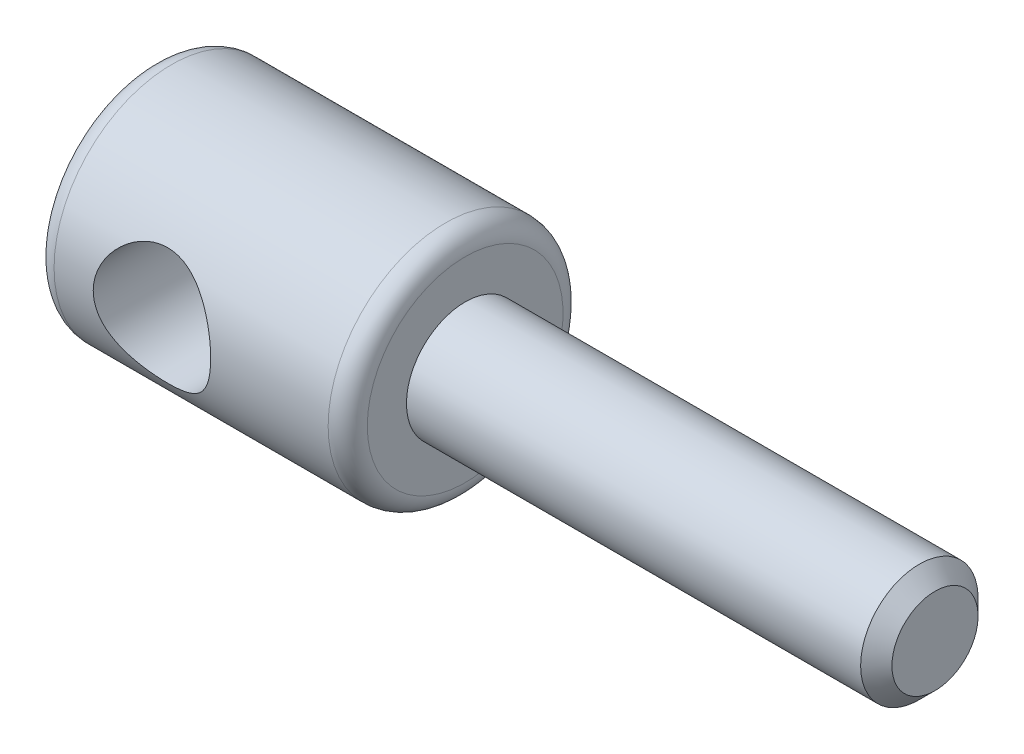
ISO-10303-21;
HEADER;
FILE_DESCRIPTION(('STEP AP214'),'2;1');
FILE_NAME('part.step','',(''),(''),'','','');
FILE_SCHEMA(('AUTOMOTIVE_DESIGN { 1 0 10303 214 1 1 1 1 }'));
ENDSEC;
DATA;
#1=APPLICATION_CONTEXT('core data for automotive mechanical design processes');
#2=APPLICATION_PROTOCOL_DEFINITION('international standard','automotive_design',2000,#1);
#3=PRODUCT_CONTEXT('',#1,'mechanical');
#4=PRODUCT('Part','Part','',(#3));
#5=PRODUCT_RELATED_PRODUCT_CATEGORY('part','',(#4));
#6=PRODUCT_DEFINITION_FORMATION('','',#4);
#7=PRODUCT_DEFINITION_CONTEXT('part definition',#1,'design');
#8=PRODUCT_DEFINITION('design','',#6,#7);
#9=PRODUCT_DEFINITION_SHAPE('','',#8);
#10=(LENGTH_UNIT() NAMED_UNIT(*) SI_UNIT(.MILLI.,.METRE.));
#11=(NAMED_UNIT(*) PLANE_ANGLE_UNIT() SI_UNIT($,.RADIAN.));
#12=(NAMED_UNIT(*) SI_UNIT($,.STERADIAN.) SOLID_ANGLE_UNIT());
#13=UNCERTAINTY_MEASURE_WITH_UNIT(LENGTH_MEASURE(1.E-05),#10,'distance_accuracy_value','');
#14=(GEOMETRIC_REPRESENTATION_CONTEXT(3) GLOBAL_UNCERTAINTY_ASSIGNED_CONTEXT((#13)) GLOBAL_UNIT_ASSIGNED_CONTEXT((#10,
#11,#12)) REPRESENTATION_CONTEXT('',''));
#15=CARTESIAN_POINT('',(0.,0.,0.));
#16=DIRECTION('',(0.,0.,1.));
#17=DIRECTION('',(1.,0.,0.));
#18=AXIS2_PLACEMENT_3D('',#15,#16,#17);
#19=CARTESIAN_POINT('',(0.,0.,0.));
#20=DIRECTION('',(1.,0.,0.));
#21=DIRECTION('',(0.,0.,-1.));
#22=AXIS2_PLACEMENT_3D('',#19,#20,#21);
#23=PLANE('',#22);
#24=CARTESIAN_POINT('',(0.,0.,0.));
#25=DIRECTION('',(1.,0.,0.));
#26=DIRECTION('',(0.,0.,-1.));
#27=AXIS2_PLACEMENT_3D('',#24,#25,#26);
#28=CIRCLE('',#27,7.9375);
#29=CARTESIAN_POINT('',(0.,0.,-7.9375));
#30=VERTEX_POINT('',#29);
#31=EDGE_CURVE('E51',#30,#30,#28,.F.);
#32=ORIENTED_EDGE('',*,*,#31,.T.);
#33=EDGE_LOOP('',(#32));
#34=FACE_BOUND('',#33,.T.);
#35=ADVANCED_FACE('F36',(#34),#23,.F.);
#36=CARTESIAN_POINT('',(-10.4442661148603,0.,0.));
#37=DIRECTION('',(-1.,0.,0.));
#38=DIRECTION('',(0.,0.,1.));
#39=AXIS2_PLACEMENT_3D('',#36,#37,#38);
#40=CYLINDRICAL_SURFACE('',#39,9.525);
#41=CARTESIAN_POINT('',(14.2875,0.,9.525));
#42=CARTESIAN_POINT('',(14.2874995883142,-0.125243167799989,9.5249996206372));
#43=CARTESIAN_POINT('',(14.2825538815409,-0.250495089131835,9.52252400598023));
#44=CARTESIAN_POINT('',(14.2628274933583,-0.500076393496526,9.51268396387997));
#45=CARTESIAN_POINT('',(14.2480425334198,-0.624405351393145,9.50531740964971));
#46=CARTESIAN_POINT('',(14.2087846575478,-0.871331001268147,9.48587193787975));
#47=CARTESIAN_POINT('',(14.184297925728,-0.993924963523297,9.47378630044847));
#48=CARTESIAN_POINT('',(14.1259077343834,-1.23637011508467,9.44520637539277));
#49=CARTESIAN_POINT('',(14.0920004252214,-1.35622016139572,9.42871028557932));
#50=CARTESIAN_POINT('',(14.0152959954649,-1.59183120722171,9.39179697222459));
#51=CARTESIAN_POINT('',(13.9725381122571,-1.70760770137533,9.37139708461428));
#52=CARTESIAN_POINT('',(13.8784500200897,-1.93495086483045,9.3271126718355));
#53=CARTESIAN_POINT('',(13.8271165847989,-2.04651593025,9.30322683559748));
#54=CARTESIAN_POINT('',(13.6609458534294,-2.37384489745524,9.22716144615755));
#55=CARTESIAN_POINT('',(13.5338526884547,-2.58250225923313,9.17053150857179));
#56=CARTESIAN_POINT('',(13.2420309696508,-2.9885453858336,9.04666081910159));
#57=CARTESIAN_POINT('',(13.0754907176509,-3.18448556312959,8.97898540114139));
#58=CARTESIAN_POINT('',(12.7134088932679,-3.5469969745544,8.84205954293001));
#59=CARTESIAN_POINT('',(12.5178454279268,-3.71354582861884,8.77280794740667));
#60=CARTESIAN_POINT('',(12.0848674226152,-4.02553537328567,8.63435408613187));
#61=CARTESIAN_POINT('',(11.8453834507436,-4.16833749963762,8.56557212539103));
#62=CARTESIAN_POINT('',(11.4681780616274,-4.35029005345508,8.47379640254792));
#63=CARTESIAN_POINT('',(11.339399825047,-4.40557901885787,8.44509626519091));
#64=CARTESIAN_POINT('',(11.0766213108777,-4.50483773649694,8.39256904955604));
#65=CARTESIAN_POINT('',(10.9426241795386,-4.54881419057647,8.36873908777994));
#66=CARTESIAN_POINT('',(10.6784843907029,-4.62261399582858,8.32818911059645));
#67=CARTESIAN_POINT('',(10.5485845780924,-4.65312214328153,8.31113119648639));
#68=CARTESIAN_POINT('',(10.2861183128582,-4.70318378391281,8.28290506375683));
#69=CARTESIAN_POINT('',(10.1535533138226,-4.72274308921002,8.27173372047612));
#70=CARTESIAN_POINT('',(9.88694274554475,-4.75061653464239,8.25575723957705));
#71=CARTESIAN_POINT('',(9.75289811708642,-4.75893744712047,8.25094826797976));
#72=CARTESIAN_POINT('',(9.48451818068096,-4.76421854927812,8.24790017307781));
#73=CARTESIAN_POINT('',(9.35018290168949,-4.76117982286954,8.24966042295241));
#74=CARTESIAN_POINT('',(9.0985605369466,-4.74483797280581,8.25906842780931));
#75=CARTESIAN_POINT('',(8.98116126726877,-4.73280973448218,8.2659846789569));
#76=CARTESIAN_POINT('',(8.74793667425509,-4.7001560114978,8.28459407928506));
#77=CARTESIAN_POINT('',(8.63211185707073,-4.67952782662532,8.29628872876442));
#78=CARTESIAN_POINT('',(8.28820359489727,-4.60506661909892,8.33800444414718));
#79=CARTESIAN_POINT('',(8.06351322141475,-4.53864529577751,8.37466460391199));
#80=CARTESIAN_POINT('',(7.62363577254265,-4.37297035741612,8.46236620531704));
#81=CARTESIAN_POINT('',(7.40879196497443,-4.27298801966147,8.51372273880604));
#82=CARTESIAN_POINT('',(6.99786249608706,-4.04355977442936,8.62505005190895));
#83=CARTESIAN_POINT('',(6.80178531682722,-3.91410063264099,8.68502469635285));
#84=CARTESIAN_POINT('',(6.40784506896536,-3.61029947812719,8.8160120789406));
#85=CARTESIAN_POINT('',(6.21290797985575,-3.43234782914613,8.88746017331488));
#86=CARTESIAN_POINT('',(5.85435121852992,-3.04584295330871,9.02721381532401));
#87=CARTESIAN_POINT('',(5.69074651343943,-2.83727518509305,9.0955178493011));
#88=CARTESIAN_POINT('',(5.46883467336283,-2.49965137796344,9.19195370403877));
#89=CARTESIAN_POINT('',(5.39748202968255,-2.38002127368373,9.22372787983903));
#90=CARTESIAN_POINT('',(5.26522178631796,-2.13427687141612,9.28366556941997));
#91=CARTESIAN_POINT('',(5.20430978353973,-2.00816533613018,9.31183060399966));
#92=CARTESIAN_POINT('',(5.09359004451779,-1.75034069526616,9.36371844925579));
#93=CARTESIAN_POINT('',(5.04377783818484,-1.61862987016266,9.38744304755806));
#94=CARTESIAN_POINT('',(4.95583376217831,-1.3505610663951,9.42974072645533));
#95=CARTESIAN_POINT('',(4.91770054882684,-1.21420362433566,9.4483143996453));
#96=CARTESIAN_POINT('',(4.85628927908232,-0.949450109300049,9.47841891468132));
#97=CARTESIAN_POINT('',(4.83204248612877,-0.821329961906903,9.49040564136936));
#98=CARTESIAN_POINT('',(4.79411534118488,-0.563164063018348,9.50921741531494));
#99=CARTESIAN_POINT('',(4.78043405513057,-0.433118482780759,9.51604291885924));
#100=CARTESIAN_POINT('',(4.76382096304197,-0.172222200636558,9.52433687415141));
#101=CARTESIAN_POINT('',(4.76088504167853,-0.0413718261918282,9.52580737679104));
#102=CARTESIAN_POINT('',(4.76579143418983,0.220072847166308,9.52335444060485));
#103=CARTESIAN_POINT('',(4.77363327106403,0.350667157156418,9.51943124049279));
#104=CARTESIAN_POINT('',(4.79896043682593,0.600383632816323,9.50681651861088));
#105=CARTESIAN_POINT('',(4.81564795465564,0.71960779805965,9.49851975936574));
#106=CARTESIAN_POINT('',(4.85791618607806,0.956123558476324,9.47763434053446));
#107=CARTESIAN_POINT('',(4.88349971649687,1.07341452918894,9.46504432155854));
#108=CARTESIAN_POINT('',(4.94328705590224,1.30523272581463,9.43586934009923));
#109=CARTESIAN_POINT('',(4.97748822700577,1.41976078572846,9.41928560017321));
#110=CARTESIAN_POINT('',(5.05418232366048,1.64542419391326,9.382499981618));
#111=CARTESIAN_POINT('',(5.09667842551346,1.75655822362735,9.36229671724176));
#112=CARTESIAN_POINT('',(5.2387002860248,2.09007412634845,9.29566539786795));
#113=CARTESIAN_POINT('',(5.35108855655025,2.3061103310862,9.24405921515466));
#114=CARTESIAN_POINT('',(5.60598846404179,2.71685918550571,9.13180205397676));
#115=CARTESIAN_POINT('',(5.74851293334768,2.91156269769227,9.07114722574502));
#116=CARTESIAN_POINT('',(6.07579489471238,3.29452731372962,8.93960783885979));
#117=CARTESIAN_POINT('',(6.26332528614419,3.48027815582499,8.868303631423));
#118=CARTESIAN_POINT('',(6.66718618662009,3.81886460963264,8.72786114875584));
#119=CARTESIAN_POINT('',(6.88353645260841,3.97167745144758,8.65872439991558));
#120=CARTESIAN_POINT('',(7.23184726433336,4.17638881115549,8.56092960704944));
#121=CARTESIAN_POINT('',(7.35506295800265,4.24173741059432,8.52864647367417));
#122=CARTESIAN_POINT('',(7.60751663099196,4.36167001930206,8.46793790675362));
#123=CARTESIAN_POINT('',(7.73675184965806,4.41625890421415,8.43951072775552));
#124=CARTESIAN_POINT('',(8.00031137614728,4.51403084118841,8.3876228681576));
#125=CARTESIAN_POINT('',(8.13463142160191,4.55722321448887,8.36415813189979));
#126=CARTESIAN_POINT('',(8.40742321829063,4.63167416627274,8.32316235190995));
#127=CARTESIAN_POINT('',(8.54589432311323,4.66293459251874,8.30563038948562));
#128=CARTESIAN_POINT('',(8.81230614491235,4.71062527640278,8.27866590076996));
#129=CARTESIAN_POINT('',(8.93998200867175,4.72819092555356,8.26861751501085));
#130=CARTESIAN_POINT('',(9.19665919652675,4.75291664228842,8.25443000373948));
#131=CARTESIAN_POINT('',(9.32566038032394,4.76007780009145,8.25029025909993));
#132=CARTESIAN_POINT('',(9.5838234710669,4.76388567177541,8.24809207938036));
#133=CARTESIAN_POINT('',(9.71298530555926,4.76053608147038,8.25003150672727));
#134=CARTESIAN_POINT('',(9.97037524394535,4.74338307929259,8.2599055190099));
#135=CARTESIAN_POINT('',(10.0986033858471,4.72958009537706,8.26783985851659));
#136=CARTESIAN_POINT('',(10.3408735925565,4.69353669139923,8.28834856879423));
#137=CARTESIAN_POINT('',(10.4550996380418,4.67222934629288,8.30040666790683));
#138=CARTESIAN_POINT('',(10.6812027840155,4.62147643847892,8.32877048505192));
#139=CARTESIAN_POINT('',(10.7930791465907,4.59202835912458,8.34507751652014));
#140=CARTESIAN_POINT('',(11.124168552145,4.49189766535446,8.3996615585496));
#141=CARTESIAN_POINT('',(11.3389944304742,4.40940547807409,8.44361545117001));
#142=CARTESIAN_POINT('',(11.7663852260527,4.20916574352957,8.54528603634261));
#143=CARTESIAN_POINT('',(11.9778285423799,4.08942191082135,8.60372898549137));
#144=CARTESIAN_POINT('',(12.3790368143899,3.82024338512735,8.72658246261696));
#145=CARTESIAN_POINT('',(12.5687904104806,3.67079324521365,8.79099608593484));
#146=CARTESIAN_POINT('',(12.9451492351934,3.32520368388597,8.92789150982252));
#147=CARTESIAN_POINT('',(13.1285704078762,3.12559766366325,9.00040265167881));
#148=CARTESIAN_POINT('',(13.4600960361771,2.69626914168463,9.13818513010387));
#149=CARTESIAN_POINT('',(13.6081814555508,2.4665305095516,9.20345255422175));
#150=CARTESIAN_POINT('',(13.8004204698368,2.10268072495819,9.29086610240478));
#151=CARTESIAN_POINT('',(13.8597008931346,1.97763300723183,9.31834760006229));
#152=CARTESIAN_POINT('',(13.9673991887047,1.72211552262134,9.36893044835914));
#153=CARTESIAN_POINT('',(14.0158223974304,1.59164845695407,9.39203394996841));
#154=CARTESIAN_POINT('',(14.1011390300447,1.32654199767926,9.43312646132604));
#155=CARTESIAN_POINT('',(14.1380576010708,1.19191242135595,9.45112661821364));
#156=CARTESIAN_POINT('',(14.2000010604458,0.919388438520272,9.48151473751691));
#157=CARTESIAN_POINT('',(14.225033214082,0.781496080561078,9.49390612793916));
#158=CARTESIAN_POINT('',(14.2584244917289,0.536297175823774,9.51048759454479));
#159=CARTESIAN_POINT('',(14.2693184453916,0.42941158376785,9.51592021375587));
#160=CARTESIAN_POINT('',(14.2838564762833,0.215019489362878,9.52317662911679));
#161=CARTESIAN_POINT('',(14.287500353405,0.107512969957934,9.52500032565785));
#162=CARTESIAN_POINT('',(14.2875,0.,9.525));
#163=B_SPLINE_CURVE_WITH_KNOTS('',3,(#41,#42,#43,#44,#45,#46,#47,#48,#49,#50,#51,#52,#53,#54,
#55,#56,#57,#58,#59,#60,#61,#62,#63,#64,#65,#66,#67,#68,#69,#70,#71,#72,#73,#74,#75,#76,#77,#78,
#79,#80,#81,#82,#83,#84,#85,#86,#87,#88,#89,#90,#91,#92,#93,#94,#95,#96,#97,#98,#99,#100,#101,
#102,#103,#104,#105,#106,#107,#108,#109,#110,#111,#112,#113,#114,#115,#116,#117,#118,#119,#120,
#121,#122,#123,#124,#125,#126,#127,#128,#129,#130,#131,#132,#133,#134,#135,#136,#137,#138,#139,
#140,#141,#142,#143,#144,#145,#146,#147,#148,#149,#150,#151,#152,#153,#154,#155,#156,#157,#158,
#159,#160,#161,#162),.UNSPECIFIED.,.T.,.F.,(4,2,2,2,2,2,2,2,2,2,2,2,2,2,2,2,2,2,2,2,2,2,2,2,2,2,
2,2,2,2,2,2,2,2,2,2,2,2,2,2,2,2,2,2,2,2,2,2,2,2,2,2,2,2,2,2,2,2,2,2,4),(0.,0.37562341815402,
0.751410280296021,1.12773421934005,1.50421216665562,1.87905550525341,2.25404018794787,
3.00318908218551,3.79765979831069,4.59273287924314,5.44946389368039,5.8781190538996,
6.30651967909289,6.70950847539315,7.11228314445237,7.51481498990845,7.91730842763879,
8.27152461989833,8.62585211283934,9.33399259637595,10.0586277474397,10.7835888844336,
11.6004728904415,12.4177461446779,12.8458801890468,13.2738332313566,13.701613616489,
14.1293447666274,14.521651524315,14.913923595397,15.3060454158579,15.698149882404,
16.0597456619957,16.4214560413944,16.7830558344937,17.144794364286,17.8882174899416,
18.6319578135026,19.4487341785404,20.2660733794108,20.6950689367829,21.1238696504806,
21.5523185520335,21.9807010777177,22.3679690015927,22.7551963432537,23.1422875423821,
23.5293628950278,23.8794231642634,24.2295917732494,24.9294696536929,25.6763690993088,
26.4236579446131,27.2617475314397,28.1002876036314,28.5230685284024,28.9456411934233,
29.3672836019069,29.7886679587935,30.1111069020891,30.4335547448008),.UNSPECIFIED.);
#164=CARTESIAN_POINT('',(14.2875,0.,9.525));
#165=VERTEX_POINT('',#164);
#166=EDGE_CURVE('E54',#165,#165,#163,.T.);
#167=ORIENTED_EDGE('',*,*,#166,.T.);
#168=EDGE_LOOP('',(#167));
#169=FACE_BOUND('',#168,.T.);
#170=CARTESIAN_POINT('',(14.2875,0.,-9.525));
#171=CARTESIAN_POINT('',(14.2874995883142,0.125243167799989,-9.5249996206372));
#172=CARTESIAN_POINT('',(14.2825538815409,0.250495089131835,-9.52252400598023));
#173=CARTESIAN_POINT('',(14.2628274933583,0.500076393496526,-9.51268396387997));
#174=CARTESIAN_POINT('',(14.2480425334198,0.624405351393145,-9.50531740964971));
#175=CARTESIAN_POINT('',(14.2087846575478,0.871331001268147,-9.48587193787975));
#176=CARTESIAN_POINT('',(14.184297925728,0.993924963523297,-9.47378630044847));
#177=CARTESIAN_POINT('',(14.1259077343834,1.23637011508467,-9.44520637539277));
#178=CARTESIAN_POINT('',(14.0920004252214,1.35622016139572,-9.42871028557932));
#179=CARTESIAN_POINT('',(14.0152959954649,1.59183120722171,-9.39179697222459));
#180=CARTESIAN_POINT('',(13.9725381122571,1.70760770137533,-9.37139708461428));
#181=CARTESIAN_POINT('',(13.8784500200897,1.93495086483045,-9.3271126718355));
#182=CARTESIAN_POINT('',(13.8271165847989,2.04651593025,-9.30322683559748));
#183=CARTESIAN_POINT('',(13.6609458534294,2.37384489745524,-9.22716144615755));
#184=CARTESIAN_POINT('',(13.5338526884547,2.58250225923313,-9.17053150857179));
#185=CARTESIAN_POINT('',(13.2420309696508,2.9885453858336,-9.04666081910159));
#186=CARTESIAN_POINT('',(13.0754907176509,3.18448556312959,-8.97898540114139));
#187=CARTESIAN_POINT('',(12.7134088932679,3.5469969745544,-8.84205954293001));
#188=CARTESIAN_POINT('',(12.5178454279268,3.71354582861884,-8.77280794740667));
#189=CARTESIAN_POINT('',(12.0848674226152,4.02553537328567,-8.63435408613187));
#190=CARTESIAN_POINT('',(11.8453834507436,4.16833749963762,-8.56557212539103));
#191=CARTESIAN_POINT('',(11.4681780616274,4.35029005345508,-8.47379640254792));
#192=CARTESIAN_POINT('',(11.339399825047,4.40557901885787,-8.44509626519091));
#193=CARTESIAN_POINT('',(11.0766213108777,4.50483773649694,-8.39256904955604));
#194=CARTESIAN_POINT('',(10.9426241795386,4.54881419057647,-8.36873908777994));
#195=CARTESIAN_POINT('',(10.6784843907029,4.62261399582858,-8.32818911059645));
#196=CARTESIAN_POINT('',(10.5485845780924,4.65312214328153,-8.31113119648639));
#197=CARTESIAN_POINT('',(10.2861183128582,4.70318378391281,-8.28290506375683));
#198=CARTESIAN_POINT('',(10.1535533138226,4.72274308921002,-8.27173372047612));
#199=CARTESIAN_POINT('',(9.88694274554475,4.75061653464239,-8.25575723957705));
#200=CARTESIAN_POINT('',(9.75289811708642,4.75893744712047,-8.25094826797976));
#201=CARTESIAN_POINT('',(9.48451818068096,4.76421854927812,-8.24790017307781));
#202=CARTESIAN_POINT('',(9.35018290168949,4.76117982286954,-8.24966042295241));
#203=CARTESIAN_POINT('',(9.0985605369466,4.74483797280581,-8.25906842780931));
#204=CARTESIAN_POINT('',(8.98116126726877,4.73280973448218,-8.2659846789569));
#205=CARTESIAN_POINT('',(8.74793667425509,4.7001560114978,-8.28459407928506));
#206=CARTESIAN_POINT('',(8.63211185707073,4.67952782662532,-8.29628872876442));
#207=CARTESIAN_POINT('',(8.28820359489727,4.60506661909892,-8.33800444414718));
#208=CARTESIAN_POINT('',(8.06351322141475,4.53864529577751,-8.37466460391199));
#209=CARTESIAN_POINT('',(7.62363577254265,4.37297035741612,-8.46236620531704));
#210=CARTESIAN_POINT('',(7.40879196497443,4.27298801966147,-8.51372273880604));
#211=CARTESIAN_POINT('',(6.99786249608706,4.04355977442936,-8.62505005190895));
#212=CARTESIAN_POINT('',(6.80178531682722,3.91410063264099,-8.68502469635285));
#213=CARTESIAN_POINT('',(6.40784506896536,3.61029947812719,-8.8160120789406));
#214=CARTESIAN_POINT('',(6.21290797985575,3.43234782914613,-8.88746017331488));
#215=CARTESIAN_POINT('',(5.85435121852992,3.04584295330871,-9.02721381532401));
#216=CARTESIAN_POINT('',(5.69074651343943,2.83727518509305,-9.0955178493011));
#217=CARTESIAN_POINT('',(5.46883467336283,2.49965137796344,-9.19195370403877));
#218=CARTESIAN_POINT('',(5.39748202968255,2.38002127368373,-9.22372787983903));
#219=CARTESIAN_POINT('',(5.26522178631796,2.13427687141612,-9.28366556941997));
#220=CARTESIAN_POINT('',(5.20430978353973,2.00816533613018,-9.31183060399966));
#221=CARTESIAN_POINT('',(5.09359004451779,1.75034069526616,-9.36371844925579));
#222=CARTESIAN_POINT('',(5.04377783818484,1.61862987016266,-9.38744304755806));
#223=CARTESIAN_POINT('',(4.95583376217831,1.3505610663951,-9.42974072645533));
#224=CARTESIAN_POINT('',(4.91770054882684,1.21420362433566,-9.4483143996453));
#225=CARTESIAN_POINT('',(4.85628927908232,0.949450109300049,-9.47841891468132));
#226=CARTESIAN_POINT('',(4.83204248612877,0.821329961906903,-9.49040564136936));
#227=CARTESIAN_POINT('',(4.79411534118488,0.563164063018348,-9.50921741531494));
#228=CARTESIAN_POINT('',(4.78043405513057,0.433118482780759,-9.51604291885924));
#229=CARTESIAN_POINT('',(4.76382096304197,0.172222200636558,-9.52433687415141));
#230=CARTESIAN_POINT('',(4.76088504167853,0.0413718261918282,-9.52580737679104));
#231=CARTESIAN_POINT('',(4.76579143418983,-0.220072847166308,-9.52335444060485));
#232=CARTESIAN_POINT('',(4.77363327106403,-0.350667157156418,-9.51943124049279));
#233=CARTESIAN_POINT('',(4.79896043682593,-0.600383632816323,-9.50681651861088));
#234=CARTESIAN_POINT('',(4.81564795465564,-0.71960779805965,-9.49851975936574));
#235=CARTESIAN_POINT('',(4.85791618607806,-0.956123558476324,-9.47763434053446));
#236=CARTESIAN_POINT('',(4.88349971649687,-1.07341452918894,-9.46504432155854));
#237=CARTESIAN_POINT('',(4.94328705590224,-1.30523272581463,-9.43586934009923));
#238=CARTESIAN_POINT('',(4.97748822700577,-1.41976078572846,-9.41928560017321));
#239=CARTESIAN_POINT('',(5.05418232366048,-1.64542419391326,-9.382499981618));
#240=CARTESIAN_POINT('',(5.09667842551346,-1.75655822362735,-9.36229671724176));
#241=CARTESIAN_POINT('',(5.2387002860248,-2.09007412634845,-9.29566539786795));
#242=CARTESIAN_POINT('',(5.35108855655025,-2.3061103310862,-9.24405921515466));
#243=CARTESIAN_POINT('',(5.60598846404179,-2.71685918550571,-9.13180205397676));
#244=CARTESIAN_POINT('',(5.74851293334768,-2.91156269769227,-9.07114722574502));
#245=CARTESIAN_POINT('',(6.07579489471238,-3.29452731372962,-8.93960783885979));
#246=CARTESIAN_POINT('',(6.26332528614419,-3.48027815582499,-8.868303631423));
#247=CARTESIAN_POINT('',(6.66718618662009,-3.81886460963264,-8.72786114875584));
#248=CARTESIAN_POINT('',(6.88353645260841,-3.97167745144758,-8.65872439991558));
#249=CARTESIAN_POINT('',(7.23184726433336,-4.17638881115549,-8.56092960704944));
#250=CARTESIAN_POINT('',(7.35506295800265,-4.24173741059432,-8.52864647367417));
#251=CARTESIAN_POINT('',(7.60751663099196,-4.36167001930206,-8.46793790675362));
#252=CARTESIAN_POINT('',(7.73675184965806,-4.41625890421415,-8.43951072775552));
#253=CARTESIAN_POINT('',(8.00031137614728,-4.51403084118841,-8.3876228681576));
#254=CARTESIAN_POINT('',(8.13463142160191,-4.55722321448887,-8.36415813189979));
#255=CARTESIAN_POINT('',(8.40742321829063,-4.63167416627274,-8.32316235190995));
#256=CARTESIAN_POINT('',(8.54589432311323,-4.66293459251874,-8.30563038948562));
#257=CARTESIAN_POINT('',(8.81230614491235,-4.71062527640278,-8.27866590076996));
#258=CARTESIAN_POINT('',(8.93998200867175,-4.72819092555356,-8.26861751501085));
#259=CARTESIAN_POINT('',(9.19665919652675,-4.75291664228842,-8.25443000373948));
#260=CARTESIAN_POINT('',(9.32566038032394,-4.76007780009145,-8.25029025909993));
#261=CARTESIAN_POINT('',(9.5838234710669,-4.76388567177541,-8.24809207938036));
#262=CARTESIAN_POINT('',(9.71298530555926,-4.76053608147038,-8.25003150672727));
#263=CARTESIAN_POINT('',(9.97037524394535,-4.74338307929259,-8.2599055190099));
#264=CARTESIAN_POINT('',(10.0986033858471,-4.72958009537706,-8.26783985851659));
#265=CARTESIAN_POINT('',(10.3408735925565,-4.69353669139923,-8.28834856879423));
#266=CARTESIAN_POINT('',(10.4550996380418,-4.67222934629288,-8.30040666790683));
#267=CARTESIAN_POINT('',(10.6812027840155,-4.62147643847892,-8.32877048505192));
#268=CARTESIAN_POINT('',(10.7930791465907,-4.59202835912458,-8.34507751652014));
#269=CARTESIAN_POINT('',(11.124168552145,-4.49189766535446,-8.3996615585496));
#270=CARTESIAN_POINT('',(11.3389944304742,-4.40940547807409,-8.44361545117001));
#271=CARTESIAN_POINT('',(11.7663852260527,-4.20916574352957,-8.54528603634261));
#272=CARTESIAN_POINT('',(11.9778285423799,-4.08942191082135,-8.60372898549137));
#273=CARTESIAN_POINT('',(12.3790368143899,-3.82024338512735,-8.72658246261696));
#274=CARTESIAN_POINT('',(12.5687904104806,-3.67079324521365,-8.79099608593484));
#275=CARTESIAN_POINT('',(12.9451492351934,-3.32520368388597,-8.92789150982252));
#276=CARTESIAN_POINT('',(13.1285704078762,-3.12559766366325,-9.00040265167881));
#277=CARTESIAN_POINT('',(13.4600960361771,-2.69626914168463,-9.13818513010387));
#278=CARTESIAN_POINT('',(13.6081814555508,-2.4665305095516,-9.20345255422175));
#279=CARTESIAN_POINT('',(13.8004204698368,-2.10268072495819,-9.29086610240478));
#280=CARTESIAN_POINT('',(13.8597008931346,-1.97763300723183,-9.31834760006229));
#281=CARTESIAN_POINT('',(13.9673991887047,-1.72211552262134,-9.36893044835914));
#282=CARTESIAN_POINT('',(14.0158223974304,-1.59164845695407,-9.39203394996841));
#283=CARTESIAN_POINT('',(14.1011390300447,-1.32654199767926,-9.43312646132604));
#284=CARTESIAN_POINT('',(14.1380576010708,-1.19191242135595,-9.45112661821364));
#285=CARTESIAN_POINT('',(14.2000010604458,-0.919388438520272,-9.48151473751691));
#286=CARTESIAN_POINT('',(14.225033214082,-0.781496080561078,-9.49390612793916));
#287=CARTESIAN_POINT('',(14.2584244917289,-0.536297175823774,-9.51048759454479));
#288=CARTESIAN_POINT('',(14.2693184453916,-0.42941158376785,-9.51592021375587));
#289=CARTESIAN_POINT('',(14.2838564762833,-0.215019489362878,-9.52317662911679));
#290=CARTESIAN_POINT('',(14.287500353405,-0.107512969957934,-9.52500032565785));
#291=CARTESIAN_POINT('',(14.2875,0.,-9.525));
#292=B_SPLINE_CURVE_WITH_KNOTS('',3,(#170,#171,#172,#173,#174,#175,#176,#177,#178,#179,#180,
#181,#182,#183,#184,#185,#186,#187,#188,#189,#190,#191,#192,#193,#194,#195,#196,#197,#198,#199,
#200,#201,#202,#203,#204,#205,#206,#207,#208,#209,#210,#211,#212,#213,#214,#215,#216,#217,#218,
#219,#220,#221,#222,#223,#224,#225,#226,#227,#228,#229,#230,#231,#232,#233,#234,#235,#236,#237,
#238,#239,#240,#241,#242,#243,#244,#245,#246,#247,#248,#249,#250,#251,#252,#253,#254,#255,#256,
#257,#258,#259,#260,#261,#262,#263,#264,#265,#266,#267,#268,#269,#270,#271,#272,#273,#274,#275,
#276,#277,#278,#279,#280,#281,#282,#283,#284,#285,#286,#287,#288,#289,#290,#291),.UNSPECIFIED.,
.T.,.F.,(4,2,2,2,2,2,2,2,2,2,2,2,2,2,2,2,2,2,2,2,2,2,2,2,2,2,2,2,2,2,2,2,2,2,2,2,2,2,2,2,2,2,2,
2,2,2,2,2,2,2,2,2,2,2,2,2,2,2,2,2,4),(0.,0.37562341815402,0.751410280296021,1.12773421934005,
1.50421216665562,1.87905550525341,2.25404018794787,3.00318908218551,3.79765979831069,
4.59273287924314,5.44946389368039,5.8781190538996,6.30651967909289,6.70950847539315,
7.11228314445237,7.51481498990845,7.91730842763879,8.27152461989833,8.62585211283934,
9.33399259637595,10.0586277474397,10.7835888844336,11.6004728904415,12.4177461446779,
12.8458801890468,13.2738332313566,13.701613616489,14.1293447666274,14.521651524315,
14.913923595397,15.3060454158579,15.698149882404,16.0597456619957,16.4214560413944,
16.7830558344937,17.144794364286,17.8882174899416,18.6319578135026,19.4487341785404,
20.2660733794108,20.6950689367829,21.1238696504806,21.5523185520335,21.9807010777177,
22.3679690015927,22.7551963432537,23.1422875423821,23.5293628950278,23.8794231642634,
24.2295917732494,24.9294696536929,25.6763690993088,26.4236579446131,27.2617475314397,
28.1002876036314,28.5230685284024,28.9456411934233,29.3672836019069,29.7886679587935,
30.1111069020891,30.4335547448008),.UNSPECIFIED.);
#293=CARTESIAN_POINT('',(14.2875,0.,-9.525));
#294=VERTEX_POINT('',#293);
#295=EDGE_CURVE('E47',#294,#294,#292,.T.);
#296=ORIENTED_EDGE('',*,*,#295,.T.);
#297=EDGE_LOOP('',(#296));
#298=FACE_BOUND('',#297,.T.);
#299=CARTESIAN_POINT('',(23.8125,0.,0.));
#300=DIRECTION('',(-1.,0.,0.));
#301=DIRECTION('',(0.,0.,1.));
#302=AXIS2_PLACEMENT_3D('',#299,#300,#301);
#303=CIRCLE('',#302,9.525);
#304=CARTESIAN_POINT('',(23.8125,0.,9.525));
#305=VERTEX_POINT('',#304);
#306=EDGE_CURVE('E108',#305,#305,#303,.T.);
#307=ORIENTED_EDGE('',*,*,#306,.T.);
#308=EDGE_LOOP('',(#307));
#309=FACE_BOUND('',#308,.T.);
#310=CARTESIAN_POINT('',(1.5875,0.,0.));
#311=DIRECTION('',(1.,0.,0.));
#312=DIRECTION('',(0.,0.,-1.));
#313=AXIS2_PLACEMENT_3D('',#310,#311,#312);
#314=CIRCLE('',#313,9.525);
#315=CARTESIAN_POINT('',(1.5875,0.,-9.525));
#316=VERTEX_POINT('',#315);
#317=EDGE_CURVE('E105',#316,#316,#314,.T.);
#318=ORIENTED_EDGE('',*,*,#317,.T.);
#319=EDGE_LOOP('',(#318));
#320=FACE_BOUND('',#319,.T.);
#321=ADVANCED_FACE('F64',(#169,#298,#309,#320),#40,.T.);
#322=CARTESIAN_POINT('',(25.4,9.525,0.));
#323=DIRECTION('',(-1.,0.,0.));
#324=DIRECTION('',(0.,0.,1.));
#325=AXIS2_PLACEMENT_3D('',#322,#323,#324);
#326=PLANE('',#325);
#327=CARTESIAN_POINT('',(25.4,0.,0.));
#328=DIRECTION('',(-1.,0.,0.));
#329=DIRECTION('',(0.,0.,1.));
#330=AXIS2_PLACEMENT_3D('',#327,#328,#329);
#331=CIRCLE('',#330,7.9375);
#332=CARTESIAN_POINT('',(25.4,0.,7.9375));
#333=VERTEX_POINT('',#332);
#334=EDGE_CURVE('E107',#333,#333,#331,.F.);
#335=ORIENTED_EDGE('',*,*,#334,.T.);
#336=EDGE_LOOP('',(#335));
#337=FACE_BOUND('',#336,.T.);
#338=CARTESIAN_POINT('',(25.4,0.,0.));
#339=DIRECTION('',(-1.,0.,0.));
#340=DIRECTION('',(0.,0.,1.));
#341=AXIS2_PLACEMENT_3D('',#338,#339,#340);
#342=CIRCLE('',#341,4.7625);
#343=CARTESIAN_POINT('',(25.4,0.,4.7625));
#344=VERTEX_POINT('',#343);
#345=EDGE_CURVE('E60',#344,#344,#342,.T.);
#346=ORIENTED_EDGE('',*,*,#345,.T.);
#347=EDGE_LOOP('',(#346));
#348=FACE_BOUND('',#347,.T.);
#349=ADVANCED_FACE('F81',(#337,#348),#326,.F.);
#350=CARTESIAN_POINT('',(-10.4442661148603,0.,0.));
#351=DIRECTION('',(-1.,0.,0.));
#352=DIRECTION('',(0.,0.,1.));
#353=AXIS2_PLACEMENT_3D('',#350,#351,#352);
#354=CYLINDRICAL_SURFACE('',#353,4.7625);
#355=CARTESIAN_POINT('',(62.23,0.,0.));
#356=DIRECTION('',(-1.,0.,0.));
#357=DIRECTION('',(0.,0.,1.));
#358=AXIS2_PLACEMENT_3D('',#355,#356,#357);
#359=CIRCLE('',#358,4.7625);
#360=CARTESIAN_POINT('',(62.23,0.,4.7625));
#361=VERTEX_POINT('',#360);
#362=EDGE_CURVE('E43',#361,#361,#359,.T.);
#363=ORIENTED_EDGE('',*,*,#362,.T.);
#364=EDGE_LOOP('',(#363));
#365=FACE_BOUND('',#364,.T.);
#366=ORIENTED_EDGE('',*,*,#345,.F.);
#367=EDGE_LOOP('',(#366));
#368=FACE_BOUND('',#367,.T.);
#369=ADVANCED_FACE('F79',(#365,#368),#354,.T.);
#370=CARTESIAN_POINT('',(63.5,4.7625,0.));
#371=DIRECTION('',(-1.,0.,0.));
#372=DIRECTION('',(0.,0.,1.));
#373=AXIS2_PLACEMENT_3D('',#370,#371,#372);
#374=PLANE('',#373);
#375=CARTESIAN_POINT('',(63.5,0.,0.));
#376=DIRECTION('',(-1.,0.,0.));
#377=DIRECTION('',(0.,0.,1.));
#378=AXIS2_PLACEMENT_3D('',#375,#376,#377);
#379=CIRCLE('',#378,3.49249999999999);
#380=CARTESIAN_POINT('',(63.5,0.,3.49249999999999));
#381=VERTEX_POINT('',#380);
#382=EDGE_CURVE('E10',#381,#381,#379,.F.);
#383=ORIENTED_EDGE('',*,*,#382,.T.);
#384=EDGE_LOOP('',(#383));
#385=FACE_BOUND('',#384,.T.);
#386=ADVANCED_FACE('F74',(#385),#374,.F.);
#387=CARTESIAN_POINT('',(23.8125,0.,0.));
#388=DIRECTION('',(-1.,0.,0.));
#389=DIRECTION('',(0.,0.,1.));
#390=AXIS2_PLACEMENT_3D('',#387,#388,#389);
#391=TOROIDAL_SURFACE('',#390,7.9375,1.5875);
#392=ORIENTED_EDGE('',*,*,#334,.F.);
#393=EDGE_LOOP('',(#392));
#394=FACE_BOUND('',#393,.T.);
#395=ORIENTED_EDGE('',*,*,#306,.F.);
#396=EDGE_LOOP('',(#395));
#397=FACE_BOUND('',#396,.T.);
#398=ADVANCED_FACE('F78',(#394,#397),#391,.T.);
#399=CARTESIAN_POINT('',(1.5875,0.,0.));
#400=DIRECTION('',(1.,0.,0.));
#401=DIRECTION('',(0.,0.,-1.));
#402=AXIS2_PLACEMENT_3D('',#399,#400,#401);
#403=TOROIDAL_SURFACE('',#402,7.9375,1.5875);
#404=ORIENTED_EDGE('',*,*,#317,.F.);
#405=EDGE_LOOP('',(#404));
#406=FACE_BOUND('',#405,.T.);
#407=ORIENTED_EDGE('',*,*,#31,.F.);
#408=EDGE_LOOP('',(#407));
#409=FACE_BOUND('',#408,.T.);
#410=ADVANCED_FACE('F72',(#406,#409),#403,.T.);
#411=CARTESIAN_POINT('',(9.525,0.,-9.525));
#412=DIRECTION('',(0.,0.,1.));
#413=DIRECTION('',(1.,0.,0.));
#414=AXIS2_PLACEMENT_3D('',#411,#412,#413);
#415=CYLINDRICAL_SURFACE('',#414,4.7625);
#416=ORIENTED_EDGE('',*,*,#166,.F.);
#417=EDGE_LOOP('',(#416));
#418=FACE_BOUND('',#417,.T.);
#419=ORIENTED_EDGE('',*,*,#295,.F.);
#420=EDGE_LOOP('',(#419));
#421=FACE_BOUND('',#420,.T.);
#422=ADVANCED_FACE('F68',(#418,#421),#415,.F.);
#423=CARTESIAN_POINT('',(62.23,0.,0.));
#424=DIRECTION('',(-1.,0.,0.));
#425=DIRECTION('',(0.,0.,1.));
#426=AXIS2_PLACEMENT_3D('',#423,#424,#425);
#427=CONICAL_SURFACE('',#426,4.7625,0.78539816339745);
#428=ORIENTED_EDGE('',*,*,#382,.F.);
#429=EDGE_LOOP('',(#428));
#430=FACE_BOUND('',#429,.T.);
#431=ORIENTED_EDGE('',*,*,#362,.F.);
#432=EDGE_LOOP('',(#431));
#433=FACE_BOUND('',#432,.T.);
#434=ADVANCED_FACE('F38',(#430,#433),#427,.T.);
#435=CLOSED_SHELL('',(#35,#321,#349,#369,#386,#398,#410,#422,#434));
#436=MANIFOLD_SOLID_BREP('B2',#435);
#437=ADVANCED_BREP_SHAPE_REPRESENTATION('',(#18,#436),#14);
#438=SHAPE_DEFINITION_REPRESENTATION(#9,#437);
ENDSEC;
END-ISO-10303-21;
